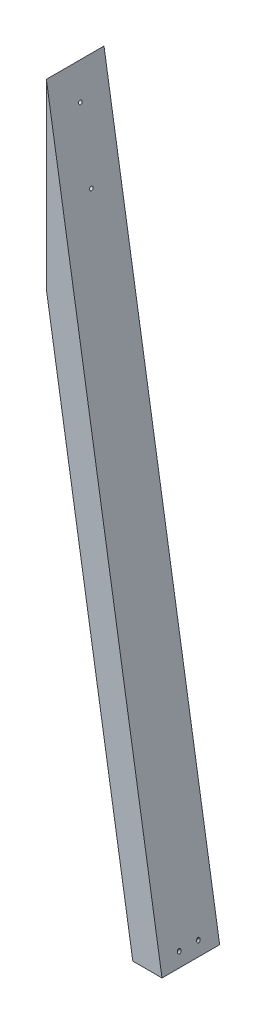
ISO-10303-21;
HEADER;
FILE_DESCRIPTION(('STEP AP214'),'2;1');
FILE_NAME('part.step','',(''),(''),'','','');
FILE_SCHEMA(('AUTOMOTIVE_DESIGN { 1 0 10303 214 1 1 1 1 }'));
ENDSEC;
DATA;
#1=APPLICATION_CONTEXT('core data for automotive mechanical design processes');
#2=APPLICATION_PROTOCOL_DEFINITION('international standard','automotive_design',2000,#1);
#3=PRODUCT_CONTEXT('',#1,'mechanical');
#4=PRODUCT('Part','Part','',(#3));
#5=PRODUCT_RELATED_PRODUCT_CATEGORY('part','',(#4));
#6=PRODUCT_DEFINITION_FORMATION('','',#4);
#7=PRODUCT_DEFINITION_CONTEXT('part definition',#1,'design');
#8=PRODUCT_DEFINITION('design','',#6,#7);
#9=PRODUCT_DEFINITION_SHAPE('','',#8);
#10=(LENGTH_UNIT() NAMED_UNIT(*) SI_UNIT(.MILLI.,.METRE.));
#11=(NAMED_UNIT(*) PLANE_ANGLE_UNIT() SI_UNIT($,.RADIAN.));
#12=(NAMED_UNIT(*) SI_UNIT($,.STERADIAN.) SOLID_ANGLE_UNIT());
#13=UNCERTAINTY_MEASURE_WITH_UNIT(LENGTH_MEASURE(1.E-05),#10,'distance_accuracy_value','');
#14=(GEOMETRIC_REPRESENTATION_CONTEXT(3) GLOBAL_UNCERTAINTY_ASSIGNED_CONTEXT((#13)) GLOBAL_UNIT_ASSIGNED_CONTEXT((#10,
#11,#12)) REPRESENTATION_CONTEXT('',''));
#15=CARTESIAN_POINT('',(0.,0.,0.));
#16=DIRECTION('',(0.,0.,1.));
#17=DIRECTION('',(1.,0.,0.));
#18=AXIS2_PLACEMENT_3D('',#15,#16,#17);
#19=CARTESIAN_POINT('',(152.4,0.,101.6));
#20=DIRECTION('',(0.987361642382423,0.158483397085891,0.));
#21=DIRECTION('',(-0.158483397085891,0.987361642382423,0.));
#22=AXIS2_PLACEMENT_3D('',#19,#20,#21);
#23=PLANE('',#22);
#24=DIRECTION('',(0.158483397085891,-0.987361642382423,0.));
#25=VECTOR('',#24,1.);
#26=CARTESIAN_POINT('',(152.4,0.,0.));
#27=LINE('',#26,#25);
#28=CARTESIAN_POINT('',(0.,949.461691671911,0.));
#29=VERTEX_POINT('',#28);
#30=CARTESIAN_POINT('',(152.4,0.,0.));
#31=VERTEX_POINT('',#30);
#32=EDGE_CURVE('E109',#29,#31,#27,.T.);
#33=ORIENTED_EDGE('',*,*,#32,.T.);
#34=DIRECTION('',(0.,0.,-1.));
#35=VECTOR('',#34,1.);
#36=CARTESIAN_POINT('',(152.4,0.,101.6));
#37=LINE('',#36,#35);
#38=CARTESIAN_POINT('',(152.4,0.,101.6));
#39=VERTEX_POINT('',#38);
#40=EDGE_CURVE('E11',#39,#31,#37,.T.);
#41=ORIENTED_EDGE('',*,*,#40,.F.);
#42=DIRECTION('',(0.158483397085891,-0.987361642382423,0.));
#43=VECTOR('',#42,1.);
#44=CARTESIAN_POINT('',(152.4,0.,101.6));
#45=LINE('',#44,#43);
#46=CARTESIAN_POINT('',(0.,949.461691671911,101.6));
#47=VERTEX_POINT('',#46);
#48=EDGE_CURVE('E92',#47,#39,#45,.T.);
#49=ORIENTED_EDGE('',*,*,#48,.F.);
#50=DIRECTION('',(0.,0.,-1.));
#51=VECTOR('',#50,1.);
#52=CARTESIAN_POINT('',(0.,949.461691671911,101.6));
#53=LINE('',#52,#51);
#54=EDGE_CURVE('E105',#47,#29,#53,.T.);
#55=ORIENTED_EDGE('',*,*,#54,.T.);
#56=EDGE_LOOP('',(#33,#41,#49,#55));
#57=FACE_BOUND('',#56,.T.);
#58=ADVANCED_FACE('F38',(#57),#23,.F.);
#59=CARTESIAN_POINT('',(203.850246616249,0.,101.6));
#60=DIRECTION('',(0.,1.,0.));
#61=DIRECTION('',(-1.,0.,0.));
#62=AXIS2_PLACEMENT_3D('',#59,#60,#61);
#63=PLANE('',#62);
#64=CARTESIAN_POINT('',(178.125123308124,0.,67.7333333333333));
#65=DIRECTION('',(0.,1.,0.));
#66=DIRECTION('',(1.,0.,0.));
#67=AXIS2_PLACEMENT_3D('',#64,#65,#66);
#68=ELLIPSE('',#67,4.49012806053459,3.175);
#69=CARTESIAN_POINT('',(182.615251368659,0.,67.7333333333333));
#70=VERTEX_POINT('',#69);
#71=EDGE_CURVE('E136',#70,#70,#68,.F.);
#72=ORIENTED_EDGE('',*,*,#71,.F.);
#73=EDGE_LOOP('',(#72));
#74=FACE_BOUND('',#73,.T.);
#75=CARTESIAN_POINT('',(178.125123308124,0.,33.8666666666667));
#76=DIRECTION('',(0.,1.,0.));
#77=DIRECTION('',(1.,0.,0.));
#78=AXIS2_PLACEMENT_3D('',#75,#76,#77);
#79=ELLIPSE('',#78,4.49012806053459,3.175);
#80=CARTESIAN_POINT('',(182.615251368659,0.,33.8666666666667));
#81=VERTEX_POINT('',#80);
#82=EDGE_CURVE('E126',#81,#81,#79,.F.);
#83=ORIENTED_EDGE('',*,*,#82,.F.);
#84=EDGE_LOOP('',(#83));
#85=FACE_BOUND('',#84,.T.);
#86=DIRECTION('',(1.,0.,0.));
#87=VECTOR('',#86,1.);
#88=CARTESIAN_POINT('',(203.850246616249,0.,0.));
#89=LINE('',#88,#87);
#90=CARTESIAN_POINT('',(203.850246616249,0.,0.));
#91=VERTEX_POINT('',#90);
#92=EDGE_CURVE('E97',#31,#91,#89,.T.);
#93=ORIENTED_EDGE('',*,*,#92,.T.);
#94=DIRECTION('',(0.,0.,-1.));
#95=VECTOR('',#94,1.);
#96=CARTESIAN_POINT('',(203.850246616249,0.,101.6));
#97=LINE('',#96,#95);
#98=CARTESIAN_POINT('',(203.850246616249,0.,101.6));
#99=VERTEX_POINT('',#98);
#100=EDGE_CURVE('E48',#99,#91,#97,.T.);
#101=ORIENTED_EDGE('',*,*,#100,.F.);
#102=DIRECTION('',(1.,0.,0.));
#103=VECTOR('',#102,1.);
#104=CARTESIAN_POINT('',(203.850246616249,0.,101.6));
#105=LINE('',#104,#103);
#106=EDGE_CURVE('E87',#39,#99,#105,.T.);
#107=ORIENTED_EDGE('',*,*,#106,.F.);
#108=ORIENTED_EDGE('',*,*,#40,.T.);
#109=EDGE_LOOP('',(#93,#101,#107,#108));
#110=FACE_BOUND('',#109,.T.);
#111=ADVANCED_FACE('F96',(#74,#85,#110),#63,.F.);
#112=CARTESIAN_POINT('',(0.,1270.,101.6));
#113=DIRECTION('',(-0.987361642382423,-0.158483397085891,0.));
#114=DIRECTION('',(0.158483397085891,-0.987361642382423,0.));
#115=AXIS2_PLACEMENT_3D('',#112,#113,#114);
#116=PLANE('',#115);
#117=CARTESIAN_POINT('',(200.292169571017,22.1670462628923,67.7333333333333));
#118=DIRECTION('',(-0.987361642382423,-0.158483397085891,0.));
#119=DIRECTION('',(-0.158483397085891,0.987361642382423,0.));
#120=AXIS2_PLACEMENT_3D('',#117,#118,#119);
#121=ELLIPSE('',#120,3.9186171828418,3.175);
#122=CARTESIAN_POINT('',(199.671133808001,26.036138560411,67.7333333333333));
#123=VERTEX_POINT('',#122);
#124=EDGE_CURVE('E41',#123,#123,#121,.F.);
#125=ORIENTED_EDGE('',*,*,#124,.F.);
#126=EDGE_LOOP('',(#125));
#127=FACE_BOUND('',#126,.T.);
#128=CARTESIAN_POINT('',(200.292169571017,22.1670462628923,33.8666666666667));
#129=DIRECTION('',(-0.987361642382423,-0.158483397085891,0.));
#130=DIRECTION('',(-0.158483397085891,0.987361642382423,0.));
#131=AXIS2_PLACEMENT_3D('',#128,#129,#130);
#132=ELLIPSE('',#131,3.9186171828418,3.175);
#133=CARTESIAN_POINT('',(199.671133808001,26.036138560411,33.8666666666667));
#134=VERTEX_POINT('',#133);
#135=EDGE_CURVE('E123',#134,#134,#132,.F.);
#136=ORIENTED_EDGE('',*,*,#135,.F.);
#137=EDGE_LOOP('',(#136));
#138=FACE_BOUND('',#137,.T.);
#139=CARTESIAN_POINT('',(9.01680864691778,1213.82470871795,50.8));
#140=DIRECTION('',(-0.987361642382423,-0.158483397085891,0.));
#141=DIRECTION('',(-0.158483397085891,0.987361642382423,0.));
#142=AXIS2_PLACEMENT_3D('',#139,#140,#141);
#143=ELLIPSE('',#142,3.21564041351557,3.17500000000003);
#144=CARTESIAN_POINT('',(8.50718303037716,1216.99970871795,50.8));
#145=VERTEX_POINT('',#144);
#146=EDGE_CURVE('E113',#145,#145,#143,.T.);
#147=ORIENTED_EDGE('',*,*,#146,.T.);
#148=EDGE_LOOP('',(#147));
#149=FACE_BOUND('',#148,.T.);
#150=CARTESIAN_POINT('',(28.539279426228,1092.19847425772,50.8));
#151=DIRECTION('',(-0.987361642382423,-0.158483397085891,0.));
#152=DIRECTION('',(-0.158483397085891,0.987361642382423,0.));
#153=AXIS2_PLACEMENT_3D('',#150,#151,#152);
#154=ELLIPSE('',#153,3.21564041351557,3.17500000000003);
#155=CARTESIAN_POINT('',(28.0296538096874,1095.37347425772,50.8));
#156=VERTEX_POINT('',#155);
#157=EDGE_CURVE('E146',#156,#156,#154,.T.);
#158=ORIENTED_EDGE('',*,*,#157,.T.);
#159=EDGE_LOOP('',(#158));
#160=FACE_BOUND('',#159,.T.);
#161=DIRECTION('',(-0.158483397085891,0.987361642382423,0.));
#162=VECTOR('',#161,1.);
#163=CARTESIAN_POINT('',(0.,1270.,0.));
#164=LINE('',#163,#162);
#165=CARTESIAN_POINT('',(0.,1270.,0.));
#166=VERTEX_POINT('',#165);
#167=EDGE_CURVE('E74',#91,#166,#164,.T.);
#168=ORIENTED_EDGE('',*,*,#167,.T.);
#169=DIRECTION('',(0.,0.,-1.));
#170=VECTOR('',#169,1.);
#171=CARTESIAN_POINT('',(0.,1270.,101.6));
#172=LINE('',#171,#170);
#173=CARTESIAN_POINT('',(0.,1270.,101.6));
#174=VERTEX_POINT('',#173);
#175=EDGE_CURVE('E99',#174,#166,#172,.T.);
#176=ORIENTED_EDGE('',*,*,#175,.F.);
#177=DIRECTION('',(-0.158483397085891,0.987361642382423,0.));
#178=VECTOR('',#177,1.);
#179=CARTESIAN_POINT('',(0.,1270.,101.6));
#180=LINE('',#179,#178);
#181=EDGE_CURVE('E90',#99,#174,#180,.T.);
#182=ORIENTED_EDGE('',*,*,#181,.F.);
#183=ORIENTED_EDGE('',*,*,#100,.T.);
#184=EDGE_LOOP('',(#168,#176,#182,#183));
#185=FACE_BOUND('',#184,.T.);
#186=ADVANCED_FACE('F101',(#127,#138,#149,#160,#185),#116,.F.);
#187=CARTESIAN_POINT('',(0.,949.461691671911,101.6));
#188=DIRECTION('',(1.,0.,0.));
#189=DIRECTION('',(0.,1.,0.));
#190=AXIS2_PLACEMENT_3D('',#187,#188,#189);
#191=PLANE('',#190);
#192=CARTESIAN_POINT('',(0.,1213.82470871795,50.8));
#193=DIRECTION('',(-1.,0.,0.));
#194=DIRECTION('',(0.,-1.,0.));
#195=AXIS2_PLACEMENT_3D('',#192,#193,#194);
#196=CIRCLE('',#195,3.17500000000003);
#197=CARTESIAN_POINT('',(0.,1210.64970871795,50.8));
#198=VERTEX_POINT('',#197);
#199=EDGE_CURVE('E142',#198,#198,#196,.T.);
#200=ORIENTED_EDGE('',*,*,#199,.F.);
#201=EDGE_LOOP('',(#200));
#202=FACE_BOUND('',#201,.T.);
#203=CARTESIAN_POINT('',(0.,1092.19847425772,50.8));
#204=DIRECTION('',(-1.,0.,0.));
#205=DIRECTION('',(0.,-1.,0.));
#206=AXIS2_PLACEMENT_3D('',#203,#204,#205);
#207=CIRCLE('',#206,3.17500000000003);
#208=CARTESIAN_POINT('',(0.,1089.02347425772,50.8));
#209=VERTEX_POINT('',#208);
#210=EDGE_CURVE('E141',#209,#209,#207,.T.);
#211=ORIENTED_EDGE('',*,*,#210,.F.);
#212=EDGE_LOOP('',(#211));
#213=FACE_BOUND('',#212,.T.);
#214=DIRECTION('',(0.,-1.,0.));
#215=VECTOR('',#214,1.);
#216=CARTESIAN_POINT('',(0.,949.461691671911,0.));
#217=LINE('',#216,#215);
#218=EDGE_CURVE('E80',#166,#29,#217,.T.);
#219=ORIENTED_EDGE('',*,*,#218,.T.);
#220=ORIENTED_EDGE('',*,*,#54,.F.);
#221=DIRECTION('',(0.,-1.,0.));
#222=VECTOR('',#221,1.);
#223=CARTESIAN_POINT('',(0.,949.461691671911,101.6));
#224=LINE('',#223,#222);
#225=EDGE_CURVE('E57',#174,#47,#224,.T.);
#226=ORIENTED_EDGE('',*,*,#225,.F.);
#227=ORIENTED_EDGE('',*,*,#175,.T.);
#228=EDGE_LOOP('',(#219,#220,#226,#227));
#229=FACE_BOUND('',#228,.T.);
#230=ADVANCED_FACE('F189',(#202,#213,#229),#191,.F.);
#231=CARTESIAN_POINT('',(0.,0.,101.6));
#232=DIRECTION('',(0.,0.,1.));
#233=DIRECTION('',(1.,0.,0.));
#234=AXIS2_PLACEMENT_3D('',#231,#232,#233);
#235=PLANE('',#234);
#236=ORIENTED_EDGE('',*,*,#48,.T.);
#237=ORIENTED_EDGE('',*,*,#106,.T.);
#238=ORIENTED_EDGE('',*,*,#181,.T.);
#239=ORIENTED_EDGE('',*,*,#225,.T.);
#240=EDGE_LOOP('',(#236,#237,#238,#239));
#241=FACE_BOUND('',#240,.T.);
#242=ADVANCED_FACE('F88',(#241),#235,.T.);
#243=CARTESIAN_POINT('',(0.,0.,0.));
#244=DIRECTION('',(0.,0.,1.));
#245=DIRECTION('',(1.,0.,0.));
#246=AXIS2_PLACEMENT_3D('',#243,#244,#245);
#247=PLANE('',#246);
#248=ORIENTED_EDGE('',*,*,#32,.F.);
#249=ORIENTED_EDGE('',*,*,#218,.F.);
#250=ORIENTED_EDGE('',*,*,#167,.F.);
#251=ORIENTED_EDGE('',*,*,#92,.F.);
#252=EDGE_LOOP('',(#248,#249,#250,#251));
#253=FACE_BOUND('',#252,.T.);
#254=ADVANCED_FACE('F172',(#253),#247,.F.);
#255=CARTESIAN_POINT('',(930.148,1092.19847425772,50.8));
#256=DIRECTION('',(-1.,0.,0.));
#257=DIRECTION('',(0.,-1.,0.));
#258=AXIS2_PLACEMENT_3D('',#255,#256,#257);
#259=CYLINDRICAL_SURFACE('',#258,3.17500000000003);
#260=ORIENTED_EDGE('',*,*,#210,.T.);
#261=EDGE_LOOP('',(#260));
#262=FACE_BOUND('',#261,.T.);
#263=ORIENTED_EDGE('',*,*,#157,.F.);
#264=EDGE_LOOP('',(#263));
#265=FACE_BOUND('',#264,.T.);
#266=ADVANCED_FACE('F163',(#262,#265),#259,.F.);
#267=CARTESIAN_POINT('',(930.148,1213.82470871795,50.8));
#268=DIRECTION('',(-1.,0.,0.));
#269=DIRECTION('',(0.,-1.,0.));
#270=AXIS2_PLACEMENT_3D('',#267,#268,#269);
#271=CYLINDRICAL_SURFACE('',#270,3.17500000000003);
#272=ORIENTED_EDGE('',*,*,#199,.T.);
#273=EDGE_LOOP('',(#272));
#274=FACE_BOUND('',#273,.T.);
#275=ORIENTED_EDGE('',*,*,#146,.F.);
#276=EDGE_LOOP('',(#275));
#277=FACE_BOUND('',#276,.T.);
#278=ADVANCED_FACE('F160',(#274,#277),#271,.F.);
#279=CARTESIAN_POINT('',(99.7482827721237,-78.3768405360004,33.8666666666667));
#280=DIRECTION('',(0.707106781186549,0.707106781186546,0.));
#281=DIRECTION('',(-0.707106781186546,0.707106781186549,0.));
#282=AXIS2_PLACEMENT_3D('',#279,#280,#281);
#283=CYLINDRICAL_SURFACE('',#282,3.175);
#284=ORIENTED_EDGE('',*,*,#135,.T.);
#285=EDGE_LOOP('',(#284));
#286=FACE_BOUND('',#285,.T.);
#287=ORIENTED_EDGE('',*,*,#82,.T.);
#288=EDGE_LOOP('',(#287));
#289=FACE_BOUND('',#288,.T.);
#290=ADVANCED_FACE('F162',(#286,#289),#283,.F.);
#291=CARTESIAN_POINT('',(99.7482827721237,-78.3768405360004,67.7333333333333));
#292=DIRECTION('',(0.707106781186549,0.707106781186546,0.));
#293=DIRECTION('',(-0.707106781186546,0.707106781186549,0.));
#294=AXIS2_PLACEMENT_3D('',#291,#292,#293);
#295=CYLINDRICAL_SURFACE('',#294,3.175);
#296=ORIENTED_EDGE('',*,*,#124,.T.);
#297=EDGE_LOOP('',(#296));
#298=FACE_BOUND('',#297,.T.);
#299=ORIENTED_EDGE('',*,*,#71,.T.);
#300=EDGE_LOOP('',(#299));
#301=FACE_BOUND('',#300,.T.);
#302=ADVANCED_FACE('F170',(#298,#301),#295,.F.);
#303=CLOSED_SHELL('',(#58,#111,#186,#230,#242,#254,#266,#278,#290,#302));
#304=MANIFOLD_SOLID_BREP('B2',#303);
#305=ADVANCED_BREP_SHAPE_REPRESENTATION('',(#18,#304),#14);
#306=SHAPE_DEFINITION_REPRESENTATION(#9,#305);
ENDSEC;
END-ISO-10303-21;
